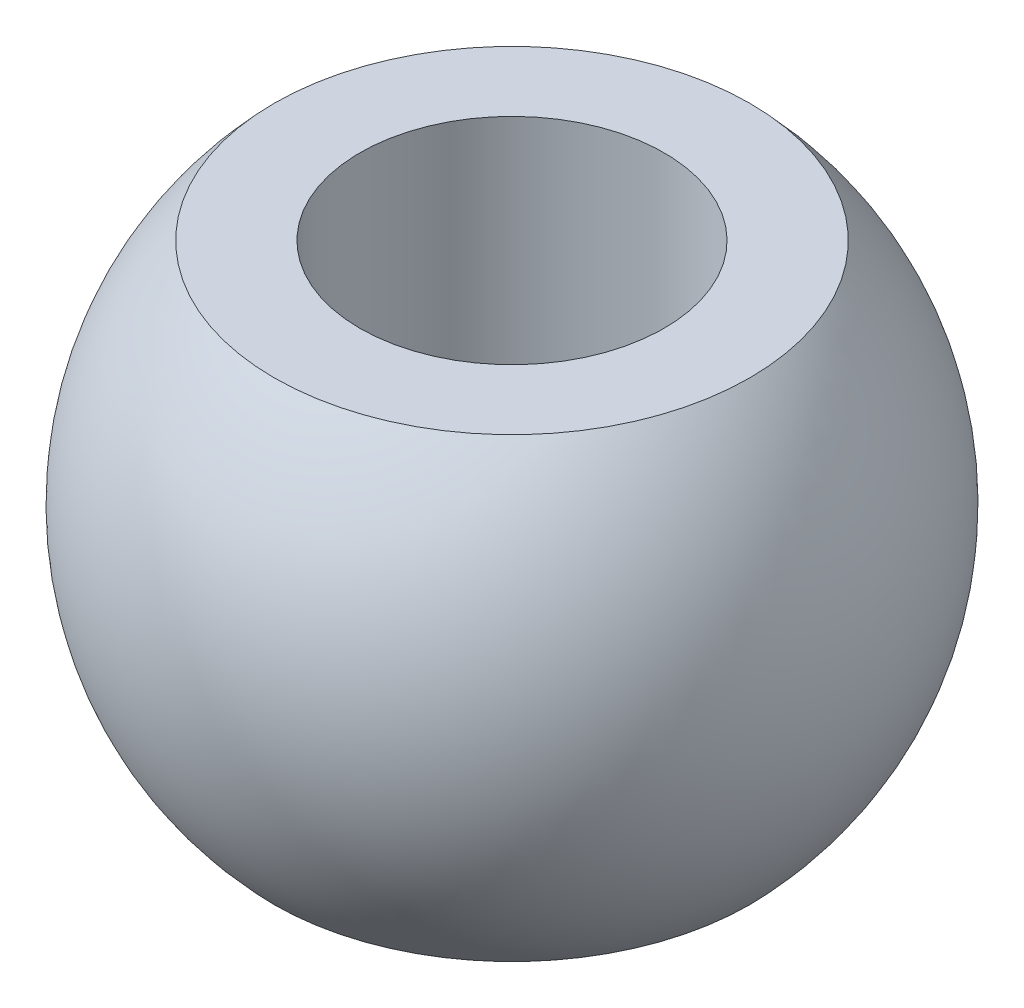
ISO-10303-21;
HEADER;
FILE_DESCRIPTION(('STEP AP214'),'2;1');
FILE_NAME('part.step','',(''),(''),'','','');
FILE_SCHEMA(('AUTOMOTIVE_DESIGN { 1 0 10303 214 1 1 1 1 }'));
ENDSEC;
DATA;
#1=APPLICATION_CONTEXT('core data for automotive mechanical design processes');
#2=APPLICATION_PROTOCOL_DEFINITION('international standard','automotive_design',2000,#1);
#3=PRODUCT_CONTEXT('',#1,'mechanical');
#4=PRODUCT('Part','Part','',(#3));
#5=PRODUCT_RELATED_PRODUCT_CATEGORY('part','',(#4));
#6=PRODUCT_DEFINITION_FORMATION('','',#4);
#7=PRODUCT_DEFINITION_CONTEXT('part definition',#1,'design');
#8=PRODUCT_DEFINITION('design','',#6,#7);
#9=PRODUCT_DEFINITION_SHAPE('','',#8);
#10=(LENGTH_UNIT() NAMED_UNIT(*) SI_UNIT(.MILLI.,.METRE.));
#11=(NAMED_UNIT(*) PLANE_ANGLE_UNIT() SI_UNIT($,.RADIAN.));
#12=(NAMED_UNIT(*) SI_UNIT($,.STERADIAN.) SOLID_ANGLE_UNIT());
#13=UNCERTAINTY_MEASURE_WITH_UNIT(LENGTH_MEASURE(1.E-05),#10,'distance_accuracy_value','');
#14=(GEOMETRIC_REPRESENTATION_CONTEXT(3) GLOBAL_UNCERTAINTY_ASSIGNED_CONTEXT((#13)) GLOBAL_UNIT_ASSIGNED_CONTEXT((#10,
#11,#12)) REPRESENTATION_CONTEXT('',''));
#15=CARTESIAN_POINT('',(0.,0.,0.));
#16=DIRECTION('',(0.,0.,1.));
#17=DIRECTION('',(1.,0.,0.));
#18=AXIS2_PLACEMENT_3D('',#15,#16,#17);
#19=CARTESIAN_POINT('',(0.,0.,0.));
#20=DIRECTION('',(0.,1.,0.));
#21=DIRECTION('',(1.,0.,0.));
#22=AXIS2_PLACEMENT_3D('',#19,#20,#21);
#23=SPHERICAL_SURFACE('',#22,3.25);
#24=CARTESIAN_POINT('',(0.,2.25,0.));
#25=DIRECTION('',(0.,1.,0.));
#26=DIRECTION('',(0.,0.,1.));
#27=AXIS2_PLACEMENT_3D('',#24,#25,#26);
#28=CIRCLE('',#27,2.34520787991171);
#29=CARTESIAN_POINT('',(2.34520787991171,2.25,0.));
#30=VERTEX_POINT('',#29);
#31=EDGE_CURVE('E10',#30,#30,#28,.T.);
#32=CARTESIAN_POINT('',(0.,-2.25,0.));
#33=DIRECTION('',(0.,1.,0.));
#34=DIRECTION('',(0.,0.,1.));
#35=AXIS2_PLACEMENT_3D('',#32,#33,#34);
#36=CIRCLE('',#35,2.34520787991171);
#37=CARTESIAN_POINT('',(2.34520787991171,-2.25,0.));
#38=VERTEX_POINT('',#37);
#39=EDGE_CURVE('E46',#38,#38,#36,.T.);
#40=CARTESIAN_POINT('',(2.34520787991171,2.25,0.));
#41=CARTESIAN_POINT('',(2.38105312102497,2.21263944562447,0.));
#42=CARTESIAN_POINT('',(2.41600407140414,2.17442102221359,0.));
#43=CARTESIAN_POINT('',(2.484040932283,2.09635864452651,0.));
#44=CARTESIAN_POINT('',(2.51712684278268,2.05651469025031,0.));
#45=CARTESIAN_POINT('',(2.58135716549124,1.97529145803796,0.));
#46=CARTESIAN_POINT('',(2.61250157770012,1.93391218010181,0.));
#47=CARTESIAN_POINT('',(2.67277802046558,1.84971300868386,0.));
#48=CARTESIAN_POINT('',(2.70191005102216,1.80689311520205,0.));
#49=CARTESIAN_POINT('',(2.75809513700381,1.7199104442168,0.));
#50=CARTESIAN_POINT('',(2.78514819242888,1.67574766671335,0.));
#51=CARTESIAN_POINT('',(2.83711356436444,1.58618009737023,0.));
#52=CARTESIAN_POINT('',(2.86202588087494,1.54077530553057,0.));
#53=CARTESIAN_POINT('',(2.90965287805141,1.44882739445456,0.));
#54=CARTESIAN_POINT('',(2.93236755871739,1.40228427521821,0.));
#55=CARTESIAN_POINT('',(2.97554741190164,1.30816600101553,0.));
#56=CARTESIAN_POINT('',(2.99601258441992,1.2605908460492,0.));
#57=CARTESIAN_POINT('',(3.03464668463402,1.16451714754075,0.));
#58=CARTESIAN_POINT('',(3.05281561232984,1.11601860399863,0.));
#59=CARTESIAN_POINT('',(3.08681573058402,1.01820888460463,0.));
#60=CARTESIAN_POINT('',(3.10264692114236,0.96889770875275,0.));
#61=CARTESIAN_POINT('',(3.13193541138677,0.869575336716122,0.));
#62=CARTESIAN_POINT('',(3.14539271107284,0.81956414053137,0.));
#63=CARTESIAN_POINT('',(3.16990268712594,0.718955938469666,0.));
#64=CARTESIAN_POINT('',(3.18095536349298,0.668358932592713,0.));
#65=CARTESIAN_POINT('',(3.20063085189464,0.566694659594569,0.));
#66=CARTESIAN_POINT('',(3.20925366392925,0.515627392473378,0.));
#67=CARTESIAN_POINT('',(3.22404973173923,0.413139219372846,0.));
#68=CARTESIAN_POINT('',(3.2302229875146,0.361718313393505,0.));
#69=CARTESIAN_POINT('',(3.24010584493355,0.258640292567783,0.));
#70=CARTESIAN_POINT('',(3.24381544657713,0.206983177721402,0.));
#71=CARTESIAN_POINT('',(3.24876252411036,0.103550708583347,0.));
#72=CARTESIAN_POINT('',(3.25,0.0517753542916733,0.));
#73=CARTESIAN_POINT('',(3.25,-0.051775354291674,0.));
#74=CARTESIAN_POINT('',(3.24876252411036,-0.103550708583348,0.));
#75=CARTESIAN_POINT('',(3.24381544657713,-0.206983177721403,0.));
#76=CARTESIAN_POINT('',(3.24010584493355,-0.258640292567784,0.));
#77=CARTESIAN_POINT('',(3.2302229875146,-0.361718313393506,0.));
#78=CARTESIAN_POINT('',(3.22404973173923,-0.413139219372847,0.));
#79=CARTESIAN_POINT('',(3.20925366392925,-0.515627392473379,0.));
#80=CARTESIAN_POINT('',(3.20063085189464,-0.56669465959457,0.));
#81=CARTESIAN_POINT('',(3.18095536349298,-0.668358932592714,0.));
#82=CARTESIAN_POINT('',(3.16990268712594,-0.718955938469667,0.));
#83=CARTESIAN_POINT('',(3.14539271107284,-0.819564140531371,0.));
#84=CARTESIAN_POINT('',(3.13193541138677,-0.869575336716123,0.));
#85=CARTESIAN_POINT('',(3.10264692114236,-0.968897708752751,0.));
#86=CARTESIAN_POINT('',(3.08681573058402,-1.01820888460463,0.));
#87=CARTESIAN_POINT('',(3.05281561232984,-1.11601860399863,0.));
#88=CARTESIAN_POINT('',(3.03464668463402,-1.16451714754075,0.));
#89=CARTESIAN_POINT('',(2.99601258441992,-1.2605908460492,0.));
#90=CARTESIAN_POINT('',(2.97554741190164,-1.30816600101553,0.));
#91=CARTESIAN_POINT('',(2.93236755871739,-1.40228427521821,0.));
#92=CARTESIAN_POINT('',(2.90965287805141,-1.44882739445456,0.));
#93=CARTESIAN_POINT('',(2.86202588087494,-1.54077530553057,0.));
#94=CARTESIAN_POINT('',(2.83711356436444,-1.58618009737023,0.));
#95=CARTESIAN_POINT('',(2.78514819242888,-1.67574766671335,0.));
#96=CARTESIAN_POINT('',(2.75809513700381,-1.7199104442168,0.));
#97=CARTESIAN_POINT('',(2.70191005102216,-1.80689311520205,0.));
#98=CARTESIAN_POINT('',(2.67277802046558,-1.84971300868386,0.));
#99=CARTESIAN_POINT('',(2.61250157770012,-1.93391218010181,0.));
#100=CARTESIAN_POINT('',(2.58135716549124,-1.97529145803796,0.));
#101=CARTESIAN_POINT('',(2.51712684278268,-2.05651469025031,0.));
#102=CARTESIAN_POINT('',(2.484040932283,-2.09635864452651,0.));
#103=CARTESIAN_POINT('',(2.41600407140414,-2.17442102221359,0.));
#104=CARTESIAN_POINT('',(2.38105312102497,-2.21263944562447,0.));
#105=CARTESIAN_POINT('',(2.34520787991171,-2.25,0.));
#106=B_SPLINE_CURVE_WITH_KNOTS('',3,(#40,#41,#42,#43,#44,#45,#46,#47,#48,#49,#50,#51,#52,#53,
#54,#55,#56,#57,#58,#59,#60,#61,#62,#63,#64,#65,#66,#67,#68,#69,#70,#71,#72,#73,#74,#75,#76,#77,
#78,#79,#80,#81,#82,#83,#84,#85,#86,#87,#88,#89,#90,#91,#92,#93,#94,#95,#96,#97,#98,#99,#100,
#101,#102,#103,#104,#105),.UNSPECIFIED.,.F.,.F.,(4,2,2,2,2,2,2,2,2,2,2,2,2,2,2,2,2,2,2,2,2,2,2,
2,2,2,2,2,2,2,2,2,4),(0.,0.155311285055729,0.310622570111457,0.465933855167186,
0.621245140222914,0.776556425278642,0.931867710334371,1.0871789953901,1.24249028044583,
1.39780156550156,1.55311285055728,1.70842413561301,1.86373542066874,2.01904670572447,
2.1743579907802,2.32966927583593,2.48498056089166,2.64029184594738,2.79560313100311,
2.95091441605884,3.10622570111457,3.2615369861703,3.41684827122603,3.57215955628175,
3.72747084133748,3.88278212639321,4.03809341144894,4.19340469650467,4.3487159815604,
4.50402726661612,4.65933855167185,4.81464983672758,4.96996112178331),.UNSPECIFIED.);
#107=EDGE_CURVE('BSEAM32',#30,#38,#106,.T.);
#108=ORIENTED_EDGE('',*,*,#31,.F.);
#109=ORIENTED_EDGE('',*,*,#39,.T.);
#110=ORIENTED_EDGE('',*,*,#107,.T.);
#111=ORIENTED_EDGE('',*,*,#107,.F.);
#112=EDGE_LOOP('',(#108,#110,#109,#111));
#113=FACE_BOUND('',#112,.T.);
#114=ADVANCED_FACE('F32',(#113),#23,.T.);
#115=CARTESIAN_POINT('',(1.5,2.25,0.));
#116=DIRECTION('',(0.,-1.,0.));
#117=DIRECTION('',(0.,0.,-1.));
#118=AXIS2_PLACEMENT_3D('',#115,#116,#117);
#119=PLANE('',#118);
#120=CARTESIAN_POINT('',(0.,2.25,0.));
#121=DIRECTION('',(0.,1.,0.));
#122=DIRECTION('',(0.,0.,1.));
#123=AXIS2_PLACEMENT_3D('',#120,#121,#122);
#124=CIRCLE('',#123,1.5);
#125=CARTESIAN_POINT('',(0.,2.25,1.5));
#126=VERTEX_POINT('',#125);
#127=EDGE_CURVE('E38',#126,#126,#124,.T.);
#128=ORIENTED_EDGE('',*,*,#127,.F.);
#129=EDGE_LOOP('',(#128));
#130=FACE_BOUND('',#129,.T.);
#131=ORIENTED_EDGE('',*,*,#31,.T.);
#132=EDGE_LOOP('',(#131));
#133=FACE_BOUND('',#132,.T.);
#134=ADVANCED_FACE('F61',(#130,#133),#119,.F.);
#135=CARTESIAN_POINT('',(0.,10.0539938484977,0.));
#136=DIRECTION('',(0.,1.,0.));
#137=DIRECTION('',(0.,0.,1.));
#138=AXIS2_PLACEMENT_3D('',#135,#136,#137);
#139=CYLINDRICAL_SURFACE('',#138,1.5);
#140=CARTESIAN_POINT('',(0.,-2.25,0.));
#141=DIRECTION('',(0.,1.,0.));
#142=DIRECTION('',(0.,0.,1.));
#143=AXIS2_PLACEMENT_3D('',#140,#141,#142);
#144=CIRCLE('',#143,1.5);
#145=CARTESIAN_POINT('',(0.,-2.25,1.5));
#146=VERTEX_POINT('',#145);
#147=EDGE_CURVE('E42',#146,#146,#144,.T.);
#148=ORIENTED_EDGE('',*,*,#147,.F.);
#149=EDGE_LOOP('',(#148));
#150=FACE_BOUND('',#149,.T.);
#151=ORIENTED_EDGE('',*,*,#127,.T.);
#152=EDGE_LOOP('',(#151));
#153=FACE_BOUND('',#152,.T.);
#154=ADVANCED_FACE('F56',(#150,#153),#139,.F.);
#155=CARTESIAN_POINT('',(1.5,-2.25,0.));
#156=DIRECTION('',(0.,1.,0.));
#157=DIRECTION('',(0.,0.,1.));
#158=AXIS2_PLACEMENT_3D('',#155,#156,#157);
#159=PLANE('',#158);
#160=ORIENTED_EDGE('',*,*,#39,.F.);
#161=EDGE_LOOP('',(#160));
#162=FACE_BOUND('',#161,.T.);
#163=ORIENTED_EDGE('',*,*,#147,.T.);
#164=EDGE_LOOP('',(#163));
#165=FACE_BOUND('',#164,.T.);
#166=ADVANCED_FACE('F53',(#162,#165),#159,.F.);
#167=CLOSED_SHELL('',(#114,#134,#154,#166));
#168=MANIFOLD_SOLID_BREP('B2',#167);
#169=ADVANCED_BREP_SHAPE_REPRESENTATION('',(#18,#168),#14);
#170=SHAPE_DEFINITION_REPRESENTATION(#9,#169);
ENDSEC;
END-ISO-10303-21;
